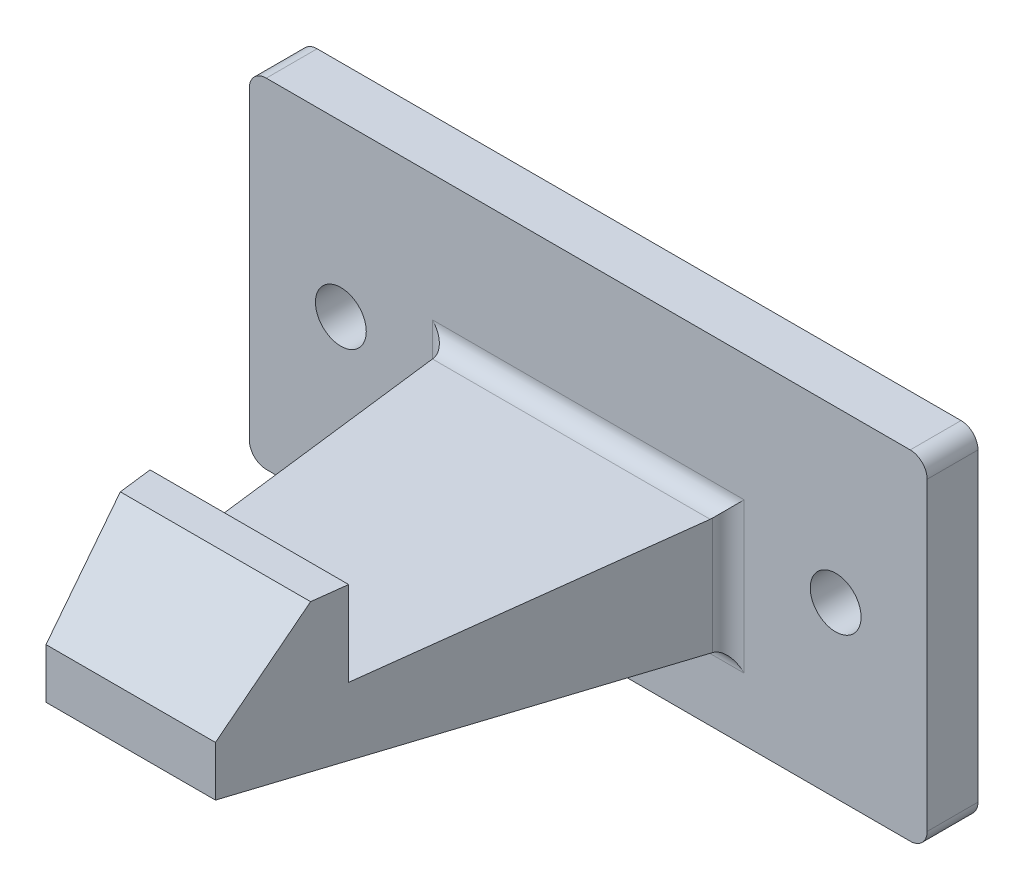
ISO-10303-21;
HEADER;
FILE_DESCRIPTION(('STEP AP214'),'2;1');
FILE_NAME('part.step','',(''),(''),'','','');
FILE_SCHEMA(('AUTOMOTIVE_DESIGN { 1 0 10303 214 1 1 1 1 }'));
ENDSEC;
DATA;
#1=APPLICATION_CONTEXT('core data for automotive mechanical design processes');
#2=APPLICATION_PROTOCOL_DEFINITION('international standard','automotive_design',2000,#1);
#3=PRODUCT_CONTEXT('',#1,'mechanical');
#4=PRODUCT('Part','Part','',(#3));
#5=PRODUCT_RELATED_PRODUCT_CATEGORY('part','',(#4));
#6=PRODUCT_DEFINITION_FORMATION('','',#4);
#7=PRODUCT_DEFINITION_CONTEXT('part definition',#1,'design');
#8=PRODUCT_DEFINITION('design','',#6,#7);
#9=PRODUCT_DEFINITION_SHAPE('','',#8);
#10=(LENGTH_UNIT() NAMED_UNIT(*) SI_UNIT(.MILLI.,.METRE.));
#11=(NAMED_UNIT(*) PLANE_ANGLE_UNIT() SI_UNIT($,.RADIAN.));
#12=(NAMED_UNIT(*) SI_UNIT($,.STERADIAN.) SOLID_ANGLE_UNIT());
#13=UNCERTAINTY_MEASURE_WITH_UNIT(LENGTH_MEASURE(1.E-05),#10,'distance_accuracy_value','');
#14=(GEOMETRIC_REPRESENTATION_CONTEXT(3) GLOBAL_UNCERTAINTY_ASSIGNED_CONTEXT((#13)) GLOBAL_UNIT_ASSIGNED_CONTEXT((#10,
#11,#12)) REPRESENTATION_CONTEXT('',''));
#15=CARTESIAN_POINT('',(0.,0.,0.));
#16=DIRECTION('',(0.,0.,1.));
#17=DIRECTION('',(1.,0.,0.));
#18=AXIS2_PLACEMENT_3D('',#15,#16,#17);
#19=CARTESIAN_POINT('',(20.,10.,3.));
#20=DIRECTION('',(-1.,0.,0.));
#21=DIRECTION('',(0.,0.,1.));
#22=AXIS2_PLACEMENT_3D('',#19,#20,#21);
#23=PLANE('',#22);
#24=DIRECTION('',(0.,1.,0.));
#25=VECTOR('',#24,1.);
#26=CARTESIAN_POINT('',(20.,10.,0.));
#27=LINE('',#26,#25);
#28=CARTESIAN_POINT('',(20.,-9.,0.));
#29=VERTEX_POINT('',#28);
#30=CARTESIAN_POINT('',(20.,9.,0.));
#31=VERTEX_POINT('',#30);
#32=EDGE_CURVE('E186',#29,#31,#27,.T.);
#33=ORIENTED_EDGE('',*,*,#32,.T.);
#34=DIRECTION('',(0.,0.,-1.));
#35=VECTOR('',#34,1.);
#36=CARTESIAN_POINT('',(20.,9.,3.));
#37=LINE('',#36,#35);
#38=CARTESIAN_POINT('',(20.,9.,3.));
#39=VERTEX_POINT('',#38);
#40=EDGE_CURVE('E292',#31,#39,#37,.F.);
#41=ORIENTED_EDGE('',*,*,#40,.T.);
#42=DIRECTION('',(0.,1.,0.));
#43=VECTOR('',#42,1.);
#44=CARTESIAN_POINT('',(20.,10.,3.));
#45=LINE('',#44,#43);
#46=CARTESIAN_POINT('',(20.,-9.,3.));
#47=VERTEX_POINT('',#46);
#48=EDGE_CURVE('E218',#47,#39,#45,.T.);
#49=ORIENTED_EDGE('',*,*,#48,.F.);
#50=DIRECTION('',(0.,0.,-1.));
#51=VECTOR('',#50,1.);
#52=CARTESIAN_POINT('',(20.,-9.,3.));
#53=LINE('',#52,#51);
#54=EDGE_CURVE('E289',#47,#29,#53,.T.);
#55=ORIENTED_EDGE('',*,*,#54,.T.);
#56=EDGE_LOOP('',(#33,#41,#49,#55));
#57=FACE_BOUND('',#56,.T.);
#58=ADVANCED_FACE('F35',(#57),#23,.F.);
#59=CARTESIAN_POINT('',(-20.,10.,3.));
#60=DIRECTION('',(0.,-1.,0.));
#61=DIRECTION('',(0.,0.,-1.));
#62=AXIS2_PLACEMENT_3D('',#59,#60,#61);
#63=PLANE('',#62);
#64=DIRECTION('',(-1.,0.,0.));
#65=VECTOR('',#64,1.);
#66=CARTESIAN_POINT('',(-20.,10.,3.));
#67=LINE('',#66,#65);
#68=CARTESIAN_POINT('',(19.,10.,3.));
#69=VERTEX_POINT('',#68);
#70=CARTESIAN_POINT('',(-19.,10.,3.));
#71=VERTEX_POINT('',#70);
#72=EDGE_CURVE('E221',#69,#71,#67,.T.);
#73=ORIENTED_EDGE('',*,*,#72,.F.);
#74=DIRECTION('',(0.,0.,-1.));
#75=VECTOR('',#74,1.);
#76=CARTESIAN_POINT('',(19.,10.,3.));
#77=LINE('',#76,#75);
#78=CARTESIAN_POINT('',(19.,10.,0.));
#79=VERTEX_POINT('',#78);
#80=EDGE_CURVE('E278',#69,#79,#77,.T.);
#81=ORIENTED_EDGE('',*,*,#80,.T.);
#82=DIRECTION('',(-1.,0.,0.));
#83=VECTOR('',#82,1.);
#84=CARTESIAN_POINT('',(-20.,10.,0.));
#85=LINE('',#84,#83);
#86=CARTESIAN_POINT('',(-19.,10.,0.));
#87=VERTEX_POINT('',#86);
#88=EDGE_CURVE('E232',#79,#87,#85,.T.);
#89=ORIENTED_EDGE('',*,*,#88,.T.);
#90=DIRECTION('',(0.,0.,-1.));
#91=VECTOR('',#90,1.);
#92=CARTESIAN_POINT('',(-19.,10.,3.));
#93=LINE('',#92,#91);
#94=EDGE_CURVE('E265',#87,#71,#93,.F.);
#95=ORIENTED_EDGE('',*,*,#94,.T.);
#96=EDGE_LOOP('',(#73,#81,#89,#95));
#97=FACE_BOUND('',#96,.T.);
#98=ADVANCED_FACE('F336',(#97),#63,.F.);
#99=CARTESIAN_POINT('',(-20.,10.,3.));
#100=DIRECTION('',(1.,0.,0.));
#101=DIRECTION('',(0.,0.,-1.));
#102=AXIS2_PLACEMENT_3D('',#99,#100,#101);
#103=PLANE('',#102);
#104=DIRECTION('',(0.,-1.,0.));
#105=VECTOR('',#104,1.);
#106=CARTESIAN_POINT('',(-20.,10.,0.));
#107=LINE('',#106,#105);
#108=CARTESIAN_POINT('',(-20.,9.,0.));
#109=VERTEX_POINT('',#108);
#110=CARTESIAN_POINT('',(-20.,-9.,0.));
#111=VERTEX_POINT('',#110);
#112=EDGE_CURVE('E235',#109,#111,#107,.T.);
#113=ORIENTED_EDGE('',*,*,#112,.T.);
#114=DIRECTION('',(0.,0.,-1.));
#115=VECTOR('',#114,1.);
#116=CARTESIAN_POINT('',(-20.,-9.,3.));
#117=LINE('',#116,#115);
#118=CARTESIAN_POINT('',(-20.,-9.,3.));
#119=VERTEX_POINT('',#118);
#120=EDGE_CURVE('E11',#111,#119,#117,.F.);
#121=ORIENTED_EDGE('',*,*,#120,.T.);
#122=DIRECTION('',(0.,-1.,0.));
#123=VECTOR('',#122,1.);
#124=CARTESIAN_POINT('',(-20.,10.,3.));
#125=LINE('',#124,#123);
#126=CARTESIAN_POINT('',(-20.,9.,3.));
#127=VERTEX_POINT('',#126);
#128=EDGE_CURVE('E225',#127,#119,#125,.T.);
#129=ORIENTED_EDGE('',*,*,#128,.F.);
#130=DIRECTION('',(0.,0.,-1.));
#131=VECTOR('',#130,1.);
#132=CARTESIAN_POINT('',(-20.,9.,3.));
#133=LINE('',#132,#131);
#134=EDGE_CURVE('E43',#127,#109,#133,.T.);
#135=ORIENTED_EDGE('',*,*,#134,.T.);
#136=EDGE_LOOP('',(#113,#121,#129,#135));
#137=FACE_BOUND('',#136,.T.);
#138=ADVANCED_FACE('F309',(#137),#103,.F.);
#139=CARTESIAN_POINT('',(-20.,-10.,3.));
#140=DIRECTION('',(0.,1.,0.));
#141=DIRECTION('',(0.,0.,1.));
#142=AXIS2_PLACEMENT_3D('',#139,#140,#141);
#143=PLANE('',#142);
#144=DIRECTION('',(1.,0.,0.));
#145=VECTOR('',#144,1.);
#146=CARTESIAN_POINT('',(-20.,-10.,0.));
#147=LINE('',#146,#145);
#148=CARTESIAN_POINT('',(-19.,-10.,0.));
#149=VERTEX_POINT('',#148);
#150=CARTESIAN_POINT('',(19.,-10.,0.));
#151=VERTEX_POINT('',#150);
#152=EDGE_CURVE('E222',#149,#151,#147,.T.);
#153=ORIENTED_EDGE('',*,*,#152,.T.);
#154=DIRECTION('',(0.,0.,-1.));
#155=VECTOR('',#154,1.);
#156=CARTESIAN_POINT('',(19.,-10.,3.));
#157=LINE('',#156,#155);
#158=CARTESIAN_POINT('',(19.,-10.,3.));
#159=VERTEX_POINT('',#158);
#160=EDGE_CURVE('E50',#151,#159,#157,.F.);
#161=ORIENTED_EDGE('',*,*,#160,.T.);
#162=DIRECTION('',(1.,0.,0.));
#163=VECTOR('',#162,1.);
#164=CARTESIAN_POINT('',(-20.,-10.,3.));
#165=LINE('',#164,#163);
#166=CARTESIAN_POINT('',(-19.,-10.,3.));
#167=VERTEX_POINT('',#166);
#168=EDGE_CURVE('E227',#167,#159,#165,.T.);
#169=ORIENTED_EDGE('',*,*,#168,.F.);
#170=DIRECTION('',(0.,0.,-1.));
#171=VECTOR('',#170,1.);
#172=CARTESIAN_POINT('',(-19.,-10.,3.));
#173=LINE('',#172,#171);
#174=EDGE_CURVE('E301',#167,#149,#173,.T.);
#175=ORIENTED_EDGE('',*,*,#174,.T.);
#176=EDGE_LOOP('',(#153,#161,#169,#175));
#177=FACE_BOUND('',#176,.T.);
#178=ADVANCED_FACE('F320',(#177),#143,.F.);
#179=CARTESIAN_POINT('',(0.,0.,3.));
#180=DIRECTION('',(0.,0.,1.));
#181=DIRECTION('',(1.,0.,0.));
#182=AXIS2_PLACEMENT_3D('',#179,#180,#181);
#183=PLANE('',#182);
#184=CARTESIAN_POINT('',(14.5999542044672,0.,3.));
#185=DIRECTION('',(0.,0.,-1.));
#186=DIRECTION('',(-1.,0.,0.));
#187=AXIS2_PLACEMENT_3D('',#184,#185,#186);
#188=CIRCLE('',#187,1.5);
#189=CARTESIAN_POINT('',(16.0999542044672,0.,3.));
#190=VERTEX_POINT('',#189);
#191=EDGE_CURVE('E561',#190,#190,#188,.T.);
#192=ORIENTED_EDGE('',*,*,#191,.T.);
#193=EDGE_LOOP('',(#192));
#194=FACE_BOUND('',#193,.T.);
#195=CARTESIAN_POINT('',(-14.5999542044672,0.,3.));
#196=DIRECTION('',(0.,0.,1.));
#197=DIRECTION('',(1.,0.,0.));
#198=AXIS2_PLACEMENT_3D('',#195,#196,#197);
#199=CIRCLE('',#198,1.5);
#200=CARTESIAN_POINT('',(-13.0999542044672,0.,3.));
#201=VERTEX_POINT('',#200);
#202=EDGE_CURVE('E565',#201,#201,#199,.T.);
#203=ORIENTED_EDGE('',*,*,#202,.F.);
#204=EDGE_LOOP('',(#203));
#205=FACE_BOUND('',#204,.T.);
#206=DIRECTION('',(0.,1.,0.));
#207=VECTOR('',#206,1.);
#208=CARTESIAN_POINT('',(-9.19990840893437,1.55,3.));
#209=LINE('',#208,#207);
#210=CARTESIAN_POINT('',(-9.19990840893437,-6.31118742080778,3.));
#211=VERTEX_POINT('',#210);
#212=CARTESIAN_POINT('',(-9.19990840893437,2.55,3.));
#213=VERTEX_POINT('',#212);
#214=EDGE_CURVE('E240',#211,#213,#209,.T.);
#215=ORIENTED_EDGE('',*,*,#214,.T.);
#216=DIRECTION('',(1.,0.,0.));
#217=VECTOR('',#216,1.);
#218=CARTESIAN_POINT('',(8.31518314437843,2.55,3.));
#219=LINE('',#218,#217);
#220=CARTESIAN_POINT('',(9.19990840893437,2.55,3.));
#221=VERTEX_POINT('',#220);
#222=EDGE_CURVE('E244',#213,#221,#219,.T.);
#223=ORIENTED_EDGE('',*,*,#222,.T.);
#224=DIRECTION('',(0.,-1.,0.));
#225=VECTOR('',#224,1.);
#226=CARTESIAN_POINT('',(9.19990840893437,-5.44999999999995,3.));
#227=LINE('',#226,#225);
#228=CARTESIAN_POINT('',(9.19990840893437,-6.31118742080778,3.));
#229=VERTEX_POINT('',#228);
#230=EDGE_CURVE('E242',#221,#229,#227,.T.);
#231=ORIENTED_EDGE('',*,*,#230,.T.);
#232=DIRECTION('',(-1.,0.,0.));
#233=VECTOR('',#232,1.);
#234=CARTESIAN_POINT('',(-8.31518314437843,-6.31118742080778,3.));
#235=LINE('',#234,#233);
#236=EDGE_CURVE('E229',#229,#211,#235,.T.);
#237=ORIENTED_EDGE('',*,*,#236,.T.);
#238=EDGE_LOOP('',(#215,#223,#231,#237));
#239=FACE_BOUND('',#238,.T.);
#240=ORIENTED_EDGE('',*,*,#48,.T.);
#241=CARTESIAN_POINT('',(19.,9.,3.));
#242=DIRECTION('',(0.,0.,1.));
#243=DIRECTION('',(1.,0.,0.));
#244=AXIS2_PLACEMENT_3D('',#241,#242,#243);
#245=CIRCLE('',#244,1.);
#246=EDGE_CURVE('E299',#39,#69,#245,.T.);
#247=ORIENTED_EDGE('',*,*,#246,.T.);
#248=ORIENTED_EDGE('',*,*,#72,.T.);
#249=CARTESIAN_POINT('',(-19.,9.,3.));
#250=DIRECTION('',(0.,0.,1.));
#251=DIRECTION('',(1.,0.,0.));
#252=AXIS2_PLACEMENT_3D('',#249,#250,#251);
#253=CIRCLE('',#252,1.);
#254=EDGE_CURVE('E294',#71,#127,#253,.T.);
#255=ORIENTED_EDGE('',*,*,#254,.T.);
#256=ORIENTED_EDGE('',*,*,#128,.T.);
#257=CARTESIAN_POINT('',(-19.,-9.,3.));
#258=DIRECTION('',(0.,0.,1.));
#259=DIRECTION('',(1.,0.,0.));
#260=AXIS2_PLACEMENT_3D('',#257,#258,#259);
#261=CIRCLE('',#260,1.);
#262=EDGE_CURVE('E57',#119,#167,#261,.T.);
#263=ORIENTED_EDGE('',*,*,#262,.T.);
#264=ORIENTED_EDGE('',*,*,#168,.T.);
#265=CARTESIAN_POINT('',(19.,-9.,3.));
#266=DIRECTION('',(0.,0.,1.));
#267=DIRECTION('',(1.,0.,0.));
#268=AXIS2_PLACEMENT_3D('',#265,#266,#267);
#269=CIRCLE('',#268,1.);
#270=EDGE_CURVE('E297',#159,#47,#269,.T.);
#271=ORIENTED_EDGE('',*,*,#270,.T.);
#272=EDGE_LOOP('',(#240,#247,#248,#255,#256,#263,#264,#271));
#273=FACE_BOUND('',#272,.T.);
#274=ADVANCED_FACE('F322',(#194,#205,#239,#273),#183,.T.);
#275=CARTESIAN_POINT('',(0.,0.,0.));
#276=DIRECTION('',(0.,0.,1.));
#277=DIRECTION('',(1.,0.,0.));
#278=AXIS2_PLACEMENT_3D('',#275,#276,#277);
#279=PLANE('',#278);
#280=CARTESIAN_POINT('',(14.5999542044672,0.,0.));
#281=DIRECTION('',(0.,0.,1.));
#282=DIRECTION('',(1.,0.,0.));
#283=AXIS2_PLACEMENT_3D('',#280,#281,#282);
#284=CIRCLE('',#283,1.5);
#285=CARTESIAN_POINT('',(16.0999542044672,0.,0.));
#286=VERTEX_POINT('',#285);
#287=EDGE_CURVE('E597',#286,#286,#284,.T.);
#288=ORIENTED_EDGE('',*,*,#287,.T.);
#289=EDGE_LOOP('',(#288));
#290=FACE_BOUND('',#289,.T.);
#291=CARTESIAN_POINT('',(-14.5999542044672,0.,0.));
#292=DIRECTION('',(0.,0.,1.));
#293=DIRECTION('',(1.,0.,0.));
#294=AXIS2_PLACEMENT_3D('',#291,#292,#293);
#295=CIRCLE('',#294,1.5);
#296=CARTESIAN_POINT('',(-13.0999542044672,0.,0.));
#297=VERTEX_POINT('',#296);
#298=EDGE_CURVE('E269',#297,#297,#295,.F.);
#299=ORIENTED_EDGE('',*,*,#298,.F.);
#300=EDGE_LOOP('',(#299));
#301=FACE_BOUND('',#300,.T.);
#302=ORIENTED_EDGE('',*,*,#88,.F.);
#303=CARTESIAN_POINT('',(19.,9.,0.));
#304=DIRECTION('',(0.,0.,1.));
#305=DIRECTION('',(1.,0.,0.));
#306=AXIS2_PLACEMENT_3D('',#303,#304,#305);
#307=CIRCLE('',#306,1.);
#308=EDGE_CURVE('E287',#79,#31,#307,.F.);
#309=ORIENTED_EDGE('',*,*,#308,.T.);
#310=ORIENTED_EDGE('',*,*,#32,.F.);
#311=CARTESIAN_POINT('',(19.,-9.,0.));
#312=DIRECTION('',(0.,0.,1.));
#313=DIRECTION('',(1.,0.,0.));
#314=AXIS2_PLACEMENT_3D('',#311,#312,#313);
#315=CIRCLE('',#314,1.);
#316=EDGE_CURVE('E285',#29,#151,#315,.F.);
#317=ORIENTED_EDGE('',*,*,#316,.T.);
#318=ORIENTED_EDGE('',*,*,#152,.F.);
#319=CARTESIAN_POINT('',(-19.,-9.,0.));
#320=DIRECTION('',(0.,0.,1.));
#321=DIRECTION('',(1.,0.,0.));
#322=AXIS2_PLACEMENT_3D('',#319,#320,#321);
#323=CIRCLE('',#322,1.);
#324=EDGE_CURVE('E283',#149,#111,#323,.F.);
#325=ORIENTED_EDGE('',*,*,#324,.T.);
#326=ORIENTED_EDGE('',*,*,#112,.F.);
#327=CARTESIAN_POINT('',(-19.,9.,0.));
#328=DIRECTION('',(0.,0.,1.));
#329=DIRECTION('',(1.,0.,0.));
#330=AXIS2_PLACEMENT_3D('',#327,#328,#329);
#331=CIRCLE('',#330,1.);
#332=EDGE_CURVE('E281',#109,#87,#331,.F.);
#333=ORIENTED_EDGE('',*,*,#332,.T.);
#334=EDGE_LOOP('',(#302,#309,#310,#317,#318,#325,#326,#333));
#335=FACE_BOUND('',#334,.T.);
#336=ADVANCED_FACE('F315',(#290,#301,#335),#279,.F.);
#337=CARTESIAN_POINT('',(0.,1.55,-483.5));
#338=DIRECTION('',(0.,1.,0.));
#339=DIRECTION('',(1.,0.,0.));
#340=AXIS2_PLACEMENT_3D('',#337,#338,#339);
#341=PLANE('',#340);
#342=DIRECTION('',(0.121869343405148,0.,-0.992546151641322));
#343=VECTOR('',#342,1.);
#344=CARTESIAN_POINT('',(5.,1.55,30.));
#345=LINE('',#344,#343);
#346=CARTESIAN_POINT('',(5.85949192632033,1.55,23.));
#347=VERTEX_POINT('',#346);
#348=CARTESIAN_POINT('',(8.19239858347552,1.55,4.));
#349=VERTEX_POINT('',#348);
#350=EDGE_CURVE('E200',#347,#349,#345,.T.);
#351=ORIENTED_EDGE('',*,*,#350,.T.);
#352=DIRECTION('',(1.,0.,0.));
#353=VECTOR('',#352,1.);
#354=CARTESIAN_POINT('',(-8.31518314437843,1.55,4.));
#355=LINE('',#354,#353);
#356=CARTESIAN_POINT('',(-8.19239858347552,1.55,4.));
#357=VERTEX_POINT('',#356);
#358=EDGE_CURVE('E247',#349,#357,#355,.F.);
#359=ORIENTED_EDGE('',*,*,#358,.T.);
#360=DIRECTION('',(0.121869343405148,0.,0.992546151641322));
#361=VECTOR('',#360,1.);
#362=CARTESIAN_POINT('',(-5.,1.55,30.));
#363=LINE('',#362,#361);
#364=CARTESIAN_POINT('',(-5.85949192632033,1.55,23.));
#365=VERTEX_POINT('',#364);
#366=EDGE_CURVE('E208',#357,#365,#363,.T.);
#367=ORIENTED_EDGE('',*,*,#366,.T.);
#368=DIRECTION('',(1.,0.,0.));
#369=VECTOR('',#368,1.);
#370=CARTESIAN_POINT('',(0.,1.55,23.));
#371=LINE('',#370,#369);
#372=EDGE_CURVE('E183',#365,#347,#371,.T.);
#373=ORIENTED_EDGE('',*,*,#372,.T.);
#374=EDGE_LOOP('',(#351,#359,#367,#373));
#375=FACE_BOUND('',#374,.T.);
#376=ADVANCED_FACE('F490',(#375),#341,.T.);
#377=CARTESIAN_POINT('',(-5.,-1.4,30.));
#378=DIRECTION('',(-0.992546151641322,0.,0.121869343405148));
#379=DIRECTION('',(-0.121869343405148,0.,-0.992546151641322));
#380=AXIS2_PLACEMENT_3D('',#377,#378,#379);
#381=PLANE('',#380);
#382=CARTESIAN_POINT('',(-8.19239858347552,2.55,4.));
#383=DIRECTION('',(-0.992546151641322,0.,0.121869343405148));
#384=DIRECTION('',(-0.121869343405148,0.,-0.992546151641322));
#385=AXIS2_PLACEMENT_3D('',#382,#383,#384);
#386=ELLIPSE('',#385,1.00750982545885,1.);
#387=CARTESIAN_POINT('',(-8.20736225729305,1.55745384835868,3.87813065659485));
#388=VERTEX_POINT('',#387);
#389=EDGE_CURVE('E258',#357,#388,#386,.F.);
#390=ORIENTED_EDGE('',*,*,#389,.T.);
#391=DIRECTION('',(0.,1.,0.));
#392=VECTOR('',#391,1.);
#393=CARTESIAN_POINT('',(-8.20736225729305,-5.44999999999995,3.87813065659485));
#394=LINE('',#393,#392);
#395=CARTESIAN_POINT('',(-8.20736225729305,-5.31828040151072,3.87813065659486));
#396=VERTEX_POINT('',#395);
#397=EDGE_CURVE('E252',#388,#396,#394,.F.);
#398=ORIENTED_EDGE('',*,*,#397,.T.);
#399=DIRECTION('',(-0.120540723140913,-0.147258811190723,-0.981725407938167));
#400=VECTOR('',#399,1.);
#401=CARTESIAN_POINT('',(-5.,-1.4,30.));
#402=LINE('',#401,#400);
#403=CARTESIAN_POINT('',(-5.,-1.4,30.));
#404=VERTEX_POINT('',#403);
#405=EDGE_CURVE('E215',#404,#396,#402,.T.);
#406=ORIENTED_EDGE('',*,*,#405,.F.);
#407=DIRECTION('',(0.,1.,0.));
#408=VECTOR('',#407,1.);
#409=CARTESIAN_POINT('',(-5.,-1.4,30.));
#410=LINE('',#409,#408);
#411=CARTESIAN_POINT('',(-5.,1.55,30.));
#412=VERTEX_POINT('',#411);
#413=EDGE_CURVE('E195',#404,#412,#410,.T.);
#414=ORIENTED_EDGE('',*,*,#413,.T.);
#415=DIRECTION('',(0.0864964017104582,-0.704456660303223,0.704456660303224));
#416=VECTOR('',#415,1.);
#417=CARTESIAN_POINT('',(-4.82024774948227,0.0860354005755817,31.4639645994244));
#418=LINE('',#417,#416);
#419=CARTESIAN_POINT('',(-5.61392280451452,6.55,25.));
#420=VERTEX_POINT('',#419);
#421=EDGE_CURVE('E193',#420,#412,#418,.T.);
#422=ORIENTED_EDGE('',*,*,#421,.F.);
#423=DIRECTION('',(-0.121869343405148,0.,-0.992546151641322));
#424=VECTOR('',#423,1.);
#425=CARTESIAN_POINT('',(-5.,6.55,30.));
#426=LINE('',#425,#424);
#427=CARTESIAN_POINT('',(-5.85949192632034,6.55,23.));
#428=VERTEX_POINT('',#427);
#429=EDGE_CURVE('E171',#420,#428,#426,.T.);
#430=ORIENTED_EDGE('',*,*,#429,.T.);
#431=DIRECTION('',(0.,1.,0.));
#432=VECTOR('',#431,1.);
#433=CARTESIAN_POINT('',(-5.85949192632034,-1.4,23.));
#434=LINE('',#433,#432);
#435=EDGE_CURVE('E176',#365,#428,#434,.T.);
#436=ORIENTED_EDGE('',*,*,#435,.F.);
#437=ORIENTED_EDGE('',*,*,#366,.F.);
#438=EDGE_LOOP('',(#390,#398,#406,#414,#422,#430,#436,#437));
#439=FACE_BOUND('',#438,.T.);
#440=ADVANCED_FACE('F190',(#439),#381,.T.);
#441=CARTESIAN_POINT('',(0.,-1.4,30.));
#442=DIRECTION('',(0.,0.,1.));
#443=DIRECTION('',(0.,1.,0.));
#444=AXIS2_PLACEMENT_3D('',#441,#442,#443);
#445=PLANE('',#444);
#446=ORIENTED_EDGE('',*,*,#413,.F.);
#447=DIRECTION('',(-1.,0.,0.));
#448=VECTOR('',#447,1.);
#449=CARTESIAN_POINT('',(0.,-1.4,30.));
#450=LINE('',#449,#448);
#451=CARTESIAN_POINT('',(5.,-1.4,30.));
#452=VERTEX_POINT('',#451);
#453=EDGE_CURVE('E214',#452,#404,#450,.T.);
#454=ORIENTED_EDGE('',*,*,#453,.F.);
#455=DIRECTION('',(0.,1.,0.));
#456=VECTOR('',#455,1.);
#457=CARTESIAN_POINT('',(5.,-1.4,30.));
#458=LINE('',#457,#456);
#459=CARTESIAN_POINT('',(5.,1.55,30.));
#460=VERTEX_POINT('',#459);
#461=EDGE_CURVE('E194',#452,#460,#458,.T.);
#462=ORIENTED_EDGE('',*,*,#461,.T.);
#463=DIRECTION('',(1.,0.,0.));
#464=VECTOR('',#463,1.);
#465=CARTESIAN_POINT('',(0.,1.55,30.));
#466=LINE('',#465,#464);
#467=EDGE_CURVE('E589',#412,#460,#466,.T.);
#468=ORIENTED_EDGE('',*,*,#467,.F.);
#469=EDGE_LOOP('',(#446,#454,#462,#468));
#470=FACE_BOUND('',#469,.T.);
#471=ADVANCED_FACE('F474',(#470),#445,.T.);
#472=CARTESIAN_POINT('',(0.,-1.4,30.));
#473=DIRECTION('',(0.,-0.988936352868298,0.148340452930243));
#474=DIRECTION('',(0.,0.148340452930243,0.988936352868298));
#475=AXIS2_PLACEMENT_3D('',#472,#473,#474);
#476=PLANE('',#475);
#477=CARTESIAN_POINT('',(-9.19990840893437,-5.29999999999995,4.));
#478=DIRECTION('',(0.,-0.988936352868298,0.148340452930243));
#479=DIRECTION('',(0.,-0.148340452930243,-0.988936352868298));
#480=AXIS2_PLACEMENT_3D('',#477,#478,#479);
#481=ELLIPSE('',#480,1.01118742080783,1.);
#482=CARTESIAN_POINT('',(-8.21097205606607,-5.32225106793949,3.85165954706976));
#483=VERTEX_POINT('',#482);
#484=EDGE_CURVE('E262',#396,#483,#481,.F.);
#485=ORIENTED_EDGE('',*,*,#484,.T.);
#486=DIRECTION('',(-1.,0.,0.));
#487=VECTOR('',#486,1.);
#488=CARTESIAN_POINT('',(8.31518314437843,-5.32225106793949,3.85165954706976));
#489=LINE('',#488,#487);
#490=CARTESIAN_POINT('',(8.21097205606607,-5.32225106793949,3.85165954706976));
#491=VERTEX_POINT('',#490);
#492=EDGE_CURVE('E254',#483,#491,#489,.F.);
#493=ORIENTED_EDGE('',*,*,#492,.T.);
#494=CARTESIAN_POINT('',(9.19990840893437,-5.29999999999995,4.));
#495=DIRECTION('',(0.,-0.988936352868298,0.148340452930243));
#496=DIRECTION('',(0.,0.148340452930243,0.988936352868298));
#497=AXIS2_PLACEMENT_3D('',#494,#495,#496);
#498=ELLIPSE('',#497,1.01118742080783,1.);
#499=CARTESIAN_POINT('',(8.20736225729305,-5.31828040151072,3.87813065659486));
#500=VERTEX_POINT('',#499);
#501=EDGE_CURVE('E260',#491,#500,#498,.F.);
#502=ORIENTED_EDGE('',*,*,#501,.T.);
#503=DIRECTION('',(-0.120540723140913,0.147258811190723,0.981725407938167));
#504=VECTOR('',#503,1.);
#505=CARTESIAN_POINT('',(5.,-1.4,30.));
#506=LINE('',#505,#504);
#507=EDGE_CURVE('E198',#500,#452,#506,.T.);
#508=ORIENTED_EDGE('',*,*,#507,.T.);
#509=ORIENTED_EDGE('',*,*,#453,.T.);
#510=ORIENTED_EDGE('',*,*,#405,.T.);
#511=EDGE_LOOP('',(#485,#493,#502,#508,#509,#510));
#512=FACE_BOUND('',#511,.T.);
#513=ADVANCED_FACE('F462',(#512),#476,.T.);
#514=CARTESIAN_POINT('',(5.,-1.4,30.));
#515=DIRECTION('',(0.992546151641322,0.,0.121869343405148));
#516=DIRECTION('',(-0.121869343405148,0.,0.992546151641322));
#517=AXIS2_PLACEMENT_3D('',#514,#515,#516);
#518=PLANE('',#517);
#519=ORIENTED_EDGE('',*,*,#507,.F.);
#520=DIRECTION('',(0.,-1.,0.));
#521=VECTOR('',#520,1.);
#522=CARTESIAN_POINT('',(8.20736225729305,1.55,3.87813065659485));
#523=LINE('',#522,#521);
#524=CARTESIAN_POINT('',(8.20736225729305,1.55745384835868,3.87813065659485));
#525=VERTEX_POINT('',#524);
#526=EDGE_CURVE('E250',#500,#525,#523,.F.);
#527=ORIENTED_EDGE('',*,*,#526,.T.);
#528=CARTESIAN_POINT('',(8.19239858347552,2.55,4.));
#529=DIRECTION('',(0.992546151641322,0.,0.121869343405148));
#530=DIRECTION('',(-0.121869343405148,0.,0.992546151641322));
#531=AXIS2_PLACEMENT_3D('',#528,#529,#530);
#532=ELLIPSE('',#531,1.00750982545885,1.);
#533=EDGE_CURVE('E256',#525,#349,#532,.F.);
#534=ORIENTED_EDGE('',*,*,#533,.T.);
#535=ORIENTED_EDGE('',*,*,#350,.F.);
#536=DIRECTION('',(0.,1.,0.));
#537=VECTOR('',#536,1.);
#538=CARTESIAN_POINT('',(5.85949192632033,1.55,23.));
#539=LINE('',#538,#537);
#540=CARTESIAN_POINT('',(5.85949192632034,6.55,23.));
#541=VERTEX_POINT('',#540);
#542=EDGE_CURVE('E207',#347,#541,#539,.T.);
#543=ORIENTED_EDGE('',*,*,#542,.T.);
#544=DIRECTION('',(-0.121869343405148,0.,0.992546151641322));
#545=VECTOR('',#544,1.);
#546=CARTESIAN_POINT('',(5.,6.55,30.));
#547=LINE('',#546,#545);
#548=CARTESIAN_POINT('',(5.61392280451452,6.55,25.));
#549=VERTEX_POINT('',#548);
#550=EDGE_CURVE('E173',#541,#549,#547,.T.);
#551=ORIENTED_EDGE('',*,*,#550,.T.);
#552=DIRECTION('',(0.0864964017104582,0.704456660303223,-0.704456660303224));
#553=VECTOR('',#552,1.);
#554=CARTESIAN_POINT('',(4.82024774948227,0.0860354005755817,31.4639645994244));
#555=LINE('',#554,#553);
#556=EDGE_CURVE('E177',#460,#549,#555,.T.);
#557=ORIENTED_EDGE('',*,*,#556,.F.);
#558=ORIENTED_EDGE('',*,*,#461,.F.);
#559=EDGE_LOOP('',(#519,#527,#534,#535,#543,#551,#557,#558));
#560=FACE_BOUND('',#559,.T.);
#561=ADVANCED_FACE('F453',(#560),#518,.T.);
#562=CARTESIAN_POINT('',(0.,1.55,30.));
#563=DIRECTION('',(0.,0.707106781186548,0.707106781186547));
#564=DIRECTION('',(0.,0.707106781186547,-0.707106781186548));
#565=AXIS2_PLACEMENT_3D('',#562,#563,#564);
#566=PLANE('',#565);
#567=DIRECTION('',(-1.,0.,0.));
#568=VECTOR('',#567,1.);
#569=CARTESIAN_POINT('',(0.,6.55,25.));
#570=LINE('',#569,#568);
#571=EDGE_CURVE('E204',#549,#420,#570,.T.);
#572=ORIENTED_EDGE('',*,*,#571,.T.);
#573=ORIENTED_EDGE('',*,*,#421,.T.);
#574=ORIENTED_EDGE('',*,*,#467,.T.);
#575=ORIENTED_EDGE('',*,*,#556,.T.);
#576=EDGE_LOOP('',(#572,#573,#574,#575));
#577=FACE_BOUND('',#576,.T.);
#578=ADVANCED_FACE('F445',(#577),#566,.T.);
#579=CARTESIAN_POINT('',(0.,1.55,23.));
#580=DIRECTION('',(0.,0.,-1.));
#581=DIRECTION('',(0.,-1.,0.));
#582=AXIS2_PLACEMENT_3D('',#579,#580,#581);
#583=PLANE('',#582);
#584=DIRECTION('',(1.,0.,0.));
#585=VECTOR('',#584,1.);
#586=CARTESIAN_POINT('',(0.,6.55,23.));
#587=LINE('',#586,#585);
#588=EDGE_CURVE('E167',#428,#541,#587,.T.);
#589=ORIENTED_EDGE('',*,*,#588,.T.);
#590=ORIENTED_EDGE('',*,*,#542,.F.);
#591=ORIENTED_EDGE('',*,*,#372,.F.);
#592=ORIENTED_EDGE('',*,*,#435,.T.);
#593=EDGE_LOOP('',(#589,#590,#591,#592));
#594=FACE_BOUND('',#593,.T.);
#595=ADVANCED_FACE('F181',(#594),#583,.T.);
#596=CARTESIAN_POINT('',(0.,6.55,23.));
#597=DIRECTION('',(0.,-1.,0.));
#598=DIRECTION('',(-1.,0.,0.));
#599=AXIS2_PLACEMENT_3D('',#596,#597,#598);
#600=PLANE('',#599);
#601=ORIENTED_EDGE('',*,*,#571,.F.);
#602=ORIENTED_EDGE('',*,*,#550,.F.);
#603=ORIENTED_EDGE('',*,*,#588,.F.);
#604=ORIENTED_EDGE('',*,*,#429,.F.);
#605=EDGE_LOOP('',(#601,#602,#603,#604));
#606=FACE_BOUND('',#605,.T.);
#607=ADVANCED_FACE('F169',(#606),#600,.F.);
#608=CARTESIAN_POINT('',(0.,-6.31118742080778,4.));
#609=DIRECTION('',(1.,0.,0.));
#610=DIRECTION('',(0.,0.,-1.));
#611=AXIS2_PLACEMENT_3D('',#608,#609,#610);
#612=CYLINDRICAL_SURFACE('',#611,1.);
#613=ORIENTED_EDGE('',*,*,#492,.F.);
#614=CARTESIAN_POINT('',(-9.19990840893437,-6.31118742080778,4.));
#615=DIRECTION('',(0.707106781186547,-0.707106781186547,0.));
#616=DIRECTION('',(0.707106781186547,0.707106781186547,0.));
#617=AXIS2_PLACEMENT_3D('',#614,#615,#616);
#618=ELLIPSE('',#617,1.41421356237309,1.);
#619=EDGE_CURVE('E210',#211,#483,#618,.T.);
#620=ORIENTED_EDGE('',*,*,#619,.F.);
#621=ORIENTED_EDGE('',*,*,#236,.F.);
#622=CARTESIAN_POINT('',(9.19990840893437,-6.31118742080778,4.));
#623=DIRECTION('',(0.707106781186547,0.707106781186547,0.));
#624=DIRECTION('',(0.707106781186547,-0.707106781186547,0.));
#625=AXIS2_PLACEMENT_3D('',#622,#623,#624);
#626=ELLIPSE('',#625,1.41421356237309,1.);
#627=EDGE_CURVE('E272',#491,#229,#626,.F.);
#628=ORIENTED_EDGE('',*,*,#627,.F.);
#629=EDGE_LOOP('',(#613,#620,#621,#628));
#630=FACE_BOUND('',#629,.T.);
#631=ADVANCED_FACE('F362',(#630),#612,.F.);
#632=CARTESIAN_POINT('',(-9.19990840893437,0.,4.));
#633=DIRECTION('',(0.,-1.,0.));
#634=DIRECTION('',(0.,0.,-1.));
#635=AXIS2_PLACEMENT_3D('',#632,#633,#634);
#636=CYLINDRICAL_SURFACE('',#635,1.);
#637=ORIENTED_EDGE('',*,*,#397,.F.);
#638=CARTESIAN_POINT('',(-9.19990840893437,2.55,4.));
#639=DIRECTION('',(-0.707106781186547,-0.707106781186547,0.));
#640=DIRECTION('',(0.707106781186547,-0.707106781186547,0.));
#641=AXIS2_PLACEMENT_3D('',#638,#639,#640);
#642=ELLIPSE('',#641,1.41421356237309,1.);
#643=EDGE_CURVE('E268',#213,#388,#642,.T.);
#644=ORIENTED_EDGE('',*,*,#643,.F.);
#645=ORIENTED_EDGE('',*,*,#214,.F.);
#646=ORIENTED_EDGE('',*,*,#619,.T.);
#647=ORIENTED_EDGE('',*,*,#484,.F.);
#648=EDGE_LOOP('',(#637,#644,#645,#646,#647));
#649=FACE_BOUND('',#648,.T.);
#650=ADVANCED_FACE('F358',(#649),#636,.F.);
#651=CARTESIAN_POINT('',(9.19990840893437,0.,4.));
#652=DIRECTION('',(0.,1.,0.));
#653=DIRECTION('',(0.,0.,1.));
#654=AXIS2_PLACEMENT_3D('',#651,#652,#653);
#655=CYLINDRICAL_SURFACE('',#654,1.);
#656=ORIENTED_EDGE('',*,*,#627,.T.);
#657=ORIENTED_EDGE('',*,*,#230,.F.);
#658=CARTESIAN_POINT('',(9.19990840893437,2.55,4.));
#659=DIRECTION('',(-0.707106781186547,0.707106781186547,0.));
#660=DIRECTION('',(0.707106781186547,0.707106781186547,0.));
#661=AXIS2_PLACEMENT_3D('',#658,#659,#660);
#662=ELLIPSE('',#661,1.41421356237309,1.);
#663=EDGE_CURVE('E266',#525,#221,#662,.F.);
#664=ORIENTED_EDGE('',*,*,#663,.F.);
#665=ORIENTED_EDGE('',*,*,#526,.F.);
#666=ORIENTED_EDGE('',*,*,#501,.F.);
#667=EDGE_LOOP('',(#656,#657,#664,#665,#666));
#668=FACE_BOUND('',#667,.T.);
#669=ADVANCED_FACE('F354',(#668),#655,.F.);
#670=CARTESIAN_POINT('',(0.,2.55,4.));
#671=DIRECTION('',(-1.,0.,0.));
#672=DIRECTION('',(0.,0.,1.));
#673=AXIS2_PLACEMENT_3D('',#670,#671,#672);
#674=CYLINDRICAL_SURFACE('',#673,1.);
#675=ORIENTED_EDGE('',*,*,#389,.F.);
#676=ORIENTED_EDGE('',*,*,#358,.F.);
#677=ORIENTED_EDGE('',*,*,#533,.F.);
#678=ORIENTED_EDGE('',*,*,#663,.T.);
#679=ORIENTED_EDGE('',*,*,#222,.F.);
#680=ORIENTED_EDGE('',*,*,#643,.T.);
#681=EDGE_LOOP('',(#675,#676,#677,#678,#679,#680));
#682=FACE_BOUND('',#681,.T.);
#683=ADVANCED_FACE('F350',(#682),#674,.F.);
#684=CARTESIAN_POINT('',(-14.5999542044672,0.,-0.00100000000000013));
#685=DIRECTION('',(0.,0.,1.));
#686=DIRECTION('',(1.,0.,0.));
#687=AXIS2_PLACEMENT_3D('',#684,#685,#686);
#688=CYLINDRICAL_SURFACE('',#687,1.5);
#689=CARTESIAN_POINT('',(-13.0999542044672,0.,3.));
#690=CARTESIAN_POINT('',(-13.0999542044672,0.,2.96875));
#691=CARTESIAN_POINT('',(-13.0999542044672,0.,2.9375));
#692=CARTESIAN_POINT('',(-13.0999542044672,0.,2.875));
#693=CARTESIAN_POINT('',(-13.0999542044672,0.,2.84375));
#694=CARTESIAN_POINT('',(-13.0999542044672,0.,2.78125));
#695=CARTESIAN_POINT('',(-13.0999542044672,0.,2.75));
#696=CARTESIAN_POINT('',(-13.0999542044672,0.,2.6875));
#697=CARTESIAN_POINT('',(-13.0999542044672,0.,2.65625));
#698=CARTESIAN_POINT('',(-13.0999542044672,0.,2.59375));
#699=CARTESIAN_POINT('',(-13.0999542044672,0.,2.5625));
#700=CARTESIAN_POINT('',(-13.0999542044672,0.,2.5));
#701=CARTESIAN_POINT('',(-13.0999542044672,0.,2.46875));
#702=CARTESIAN_POINT('',(-13.0999542044672,0.,2.40625));
#703=CARTESIAN_POINT('',(-13.0999542044672,0.,2.375));
#704=CARTESIAN_POINT('',(-13.0999542044672,0.,2.3125));
#705=CARTESIAN_POINT('',(-13.0999542044672,0.,2.28125));
#706=CARTESIAN_POINT('',(-13.0999542044672,0.,2.21875));
#707=CARTESIAN_POINT('',(-13.0999542044672,0.,2.1875));
#708=CARTESIAN_POINT('',(-13.0999542044672,0.,2.125));
#709=CARTESIAN_POINT('',(-13.0999542044672,0.,2.09375));
#710=CARTESIAN_POINT('',(-13.0999542044672,0.,2.03125));
#711=CARTESIAN_POINT('',(-13.0999542044672,0.,2.));
#712=CARTESIAN_POINT('',(-13.0999542044672,0.,1.9375));
#713=CARTESIAN_POINT('',(-13.0999542044672,0.,1.90625));
#714=CARTESIAN_POINT('',(-13.0999542044672,0.,1.84375));
#715=CARTESIAN_POINT('',(-13.0999542044672,0.,1.8125));
#716=CARTESIAN_POINT('',(-13.0999542044672,0.,1.75));
#717=CARTESIAN_POINT('',(-13.0999542044672,0.,1.71875));
#718=CARTESIAN_POINT('',(-13.0999542044672,0.,1.65625));
#719=CARTESIAN_POINT('',(-13.0999542044672,0.,1.625));
#720=CARTESIAN_POINT('',(-13.0999542044672,0.,1.5625));
#721=CARTESIAN_POINT('',(-13.0999542044672,0.,1.53125));
#722=CARTESIAN_POINT('',(-13.0999542044672,0.,1.46875));
#723=CARTESIAN_POINT('',(-13.0999542044672,0.,1.4375));
#724=CARTESIAN_POINT('',(-13.0999542044672,0.,1.375));
#725=CARTESIAN_POINT('',(-13.0999542044672,0.,1.34375));
#726=CARTESIAN_POINT('',(-13.0999542044672,0.,1.28125));
#727=CARTESIAN_POINT('',(-13.0999542044672,0.,1.25));
#728=CARTESIAN_POINT('',(-13.0999542044672,0.,1.1875));
#729=CARTESIAN_POINT('',(-13.0999542044672,0.,1.15625));
#730=CARTESIAN_POINT('',(-13.0999542044672,0.,1.09375));
#731=CARTESIAN_POINT('',(-13.0999542044672,0.,1.0625));
#732=CARTESIAN_POINT('',(-13.0999542044672,0.,1.));
#733=CARTESIAN_POINT('',(-13.0999542044672,0.,0.96875));
#734=CARTESIAN_POINT('',(-13.0999542044672,0.,0.90625));
#735=CARTESIAN_POINT('',(-13.0999542044672,0.,0.875));
#736=CARTESIAN_POINT('',(-13.0999542044672,0.,0.8125));
#737=CARTESIAN_POINT('',(-13.0999542044672,0.,0.78125));
#738=CARTESIAN_POINT('',(-13.0999542044672,0.,0.71875));
#739=CARTESIAN_POINT('',(-13.0999542044672,0.,0.6875));
#740=CARTESIAN_POINT('',(-13.0999542044672,0.,0.625));
#741=CARTESIAN_POINT('',(-13.0999542044672,0.,0.59375));
#742=CARTESIAN_POINT('',(-13.0999542044672,0.,0.53125));
#743=CARTESIAN_POINT('',(-13.0999542044672,0.,0.5));
#744=CARTESIAN_POINT('',(-13.0999542044672,0.,0.4375));
#745=CARTESIAN_POINT('',(-13.0999542044672,0.,0.40625));
#746=CARTESIAN_POINT('',(-13.0999542044672,0.,0.34375));
#747=CARTESIAN_POINT('',(-13.0999542044672,0.,0.3125));
#748=CARTESIAN_POINT('',(-13.0999542044672,0.,0.25));
#749=CARTESIAN_POINT('',(-13.0999542044672,0.,0.21875));
#750=CARTESIAN_POINT('',(-13.0999542044672,0.,0.15625));
#751=CARTESIAN_POINT('',(-13.0999542044672,0.,0.125));
#752=CARTESIAN_POINT('',(-13.0999542044672,0.,0.0625000000000001));
#753=CARTESIAN_POINT('',(-13.0999542044672,0.,0.0312500000000001));
#754=CARTESIAN_POINT('',(-13.0999542044672,0.,0.));
#755=B_SPLINE_CURVE_WITH_KNOTS('',3,(#689,#690,#691,#692,#693,#694,#695,#696,#697,#698,#699,
#700,#701,#702,#703,#704,#705,#706,#707,#708,#709,#710,#711,#712,#713,#714,#715,#716,#717,#718,
#719,#720,#721,#722,#723,#724,#725,#726,#727,#728,#729,#730,#731,#732,#733,#734,#735,#736,#737,
#738,#739,#740,#741,#742,#743,#744,#745,#746,#747,#748,#749,#750,#751,#752,#753,#754),
.UNSPECIFIED.,.F.,.F.,(4,2,2,2,2,2,2,2,2,2,2,2,2,2,2,2,2,2,2,2,2,2,2,2,2,2,2,2,2,2,2,2,4),(0.,
0.0937500000000001,0.1875,0.28125,0.375,0.46875,0.5625,0.65625,0.75,0.84375,0.9375,1.03125,
1.125,1.21875,1.3125,1.40625,1.5,1.59375,1.6875,1.78125,1.875,1.96875,2.0625,2.15625,2.25,
2.34375,2.4375,2.53125,2.625,2.71875,2.8125,2.90625,3.),.UNSPECIFIED.);
#756=EDGE_CURVE('BSEAM353',#201,#297,#755,.T.);
#757=ORIENTED_EDGE('',*,*,#202,.T.);
#758=ORIENTED_EDGE('',*,*,#298,.T.);
#759=ORIENTED_EDGE('',*,*,#756,.T.);
#760=ORIENTED_EDGE('',*,*,#756,.F.);
#761=EDGE_LOOP('',(#757,#759,#758,#760));
#762=FACE_BOUND('',#761,.T.);
#763=ADVANCED_FACE('F353',(#762),#688,.F.);
#764=CARTESIAN_POINT('',(14.5999542044672,0.,-0.00100000000000013));
#765=DIRECTION('',(0.,0.,1.));
#766=DIRECTION('',(1.,0.,0.));
#767=AXIS2_PLACEMENT_3D('',#764,#765,#766);
#768=CYLINDRICAL_SURFACE('',#767,1.5);
#769=CARTESIAN_POINT('',(16.0999542044672,0.,3.));
#770=CARTESIAN_POINT('',(16.0999542044672,0.,2.96875));
#771=CARTESIAN_POINT('',(16.0999542044672,0.,2.9375));
#772=CARTESIAN_POINT('',(16.0999542044672,0.,2.875));
#773=CARTESIAN_POINT('',(16.0999542044672,0.,2.84375));
#774=CARTESIAN_POINT('',(16.0999542044672,0.,2.78125));
#775=CARTESIAN_POINT('',(16.0999542044672,0.,2.75));
#776=CARTESIAN_POINT('',(16.0999542044672,0.,2.6875));
#777=CARTESIAN_POINT('',(16.0999542044672,0.,2.65625));
#778=CARTESIAN_POINT('',(16.0999542044672,0.,2.59375));
#779=CARTESIAN_POINT('',(16.0999542044672,0.,2.5625));
#780=CARTESIAN_POINT('',(16.0999542044672,0.,2.5));
#781=CARTESIAN_POINT('',(16.0999542044672,0.,2.46875));
#782=CARTESIAN_POINT('',(16.0999542044672,0.,2.40625));
#783=CARTESIAN_POINT('',(16.0999542044672,0.,2.375));
#784=CARTESIAN_POINT('',(16.0999542044672,0.,2.3125));
#785=CARTESIAN_POINT('',(16.0999542044672,0.,2.28125));
#786=CARTESIAN_POINT('',(16.0999542044672,0.,2.21875));
#787=CARTESIAN_POINT('',(16.0999542044672,0.,2.1875));
#788=CARTESIAN_POINT('',(16.0999542044672,0.,2.125));
#789=CARTESIAN_POINT('',(16.0999542044672,0.,2.09375));
#790=CARTESIAN_POINT('',(16.0999542044672,0.,2.03125));
#791=CARTESIAN_POINT('',(16.0999542044672,0.,2.));
#792=CARTESIAN_POINT('',(16.0999542044672,0.,1.9375));
#793=CARTESIAN_POINT('',(16.0999542044672,0.,1.90625));
#794=CARTESIAN_POINT('',(16.0999542044672,0.,1.84375));
#795=CARTESIAN_POINT('',(16.0999542044672,0.,1.8125));
#796=CARTESIAN_POINT('',(16.0999542044672,0.,1.75));
#797=CARTESIAN_POINT('',(16.0999542044672,0.,1.71875));
#798=CARTESIAN_POINT('',(16.0999542044672,0.,1.65625));
#799=CARTESIAN_POINT('',(16.0999542044672,0.,1.625));
#800=CARTESIAN_POINT('',(16.0999542044672,0.,1.5625));
#801=CARTESIAN_POINT('',(16.0999542044672,0.,1.53125));
#802=CARTESIAN_POINT('',(16.0999542044672,0.,1.46875));
#803=CARTESIAN_POINT('',(16.0999542044672,0.,1.4375));
#804=CARTESIAN_POINT('',(16.0999542044672,0.,1.375));
#805=CARTESIAN_POINT('',(16.0999542044672,0.,1.34375));
#806=CARTESIAN_POINT('',(16.0999542044672,0.,1.28125));
#807=CARTESIAN_POINT('',(16.0999542044672,0.,1.25));
#808=CARTESIAN_POINT('',(16.0999542044672,0.,1.1875));
#809=CARTESIAN_POINT('',(16.0999542044672,0.,1.15625));
#810=CARTESIAN_POINT('',(16.0999542044672,0.,1.09375));
#811=CARTESIAN_POINT('',(16.0999542044672,0.,1.0625));
#812=CARTESIAN_POINT('',(16.0999542044672,0.,1.));
#813=CARTESIAN_POINT('',(16.0999542044672,0.,0.96875));
#814=CARTESIAN_POINT('',(16.0999542044672,0.,0.90625));
#815=CARTESIAN_POINT('',(16.0999542044672,0.,0.875));
#816=CARTESIAN_POINT('',(16.0999542044672,0.,0.8125));
#817=CARTESIAN_POINT('',(16.0999542044672,0.,0.78125));
#818=CARTESIAN_POINT('',(16.0999542044672,0.,0.71875));
#819=CARTESIAN_POINT('',(16.0999542044672,0.,0.6875));
#820=CARTESIAN_POINT('',(16.0999542044672,0.,0.625));
#821=CARTESIAN_POINT('',(16.0999542044672,0.,0.59375));
#822=CARTESIAN_POINT('',(16.0999542044672,0.,0.53125));
#823=CARTESIAN_POINT('',(16.0999542044672,0.,0.5));
#824=CARTESIAN_POINT('',(16.0999542044672,0.,0.4375));
#825=CARTESIAN_POINT('',(16.0999542044672,0.,0.40625));
#826=CARTESIAN_POINT('',(16.0999542044672,0.,0.34375));
#827=CARTESIAN_POINT('',(16.0999542044672,0.,0.3125));
#828=CARTESIAN_POINT('',(16.0999542044672,0.,0.25));
#829=CARTESIAN_POINT('',(16.0999542044672,0.,0.21875));
#830=CARTESIAN_POINT('',(16.0999542044672,0.,0.15625));
#831=CARTESIAN_POINT('',(16.0999542044672,0.,0.125));
#832=CARTESIAN_POINT('',(16.0999542044672,0.,0.0625000000000001));
#833=CARTESIAN_POINT('',(16.0999542044672,0.,0.03125));
#834=CARTESIAN_POINT('',(16.0999542044672,0.,0.));
#835=B_SPLINE_CURVE_WITH_KNOTS('',3,(#769,#770,#771,#772,#773,#774,#775,#776,#777,#778,#779,
#780,#781,#782,#783,#784,#785,#786,#787,#788,#789,#790,#791,#792,#793,#794,#795,#796,#797,#798,
#799,#800,#801,#802,#803,#804,#805,#806,#807,#808,#809,#810,#811,#812,#813,#814,#815,#816,#817,
#818,#819,#820,#821,#822,#823,#824,#825,#826,#827,#828,#829,#830,#831,#832,#833,#834),
.UNSPECIFIED.,.F.,.F.,(4,2,2,2,2,2,2,2,2,2,2,2,2,2,2,2,2,2,2,2,2,2,2,2,2,2,2,2,2,2,2,2,4),(0.,
0.0937500000000001,0.1875,0.28125,0.375,0.46875,0.5625,0.65625,0.75,0.84375,0.9375,1.03125,
1.125,1.21875,1.3125,1.40625,1.5,1.59375,1.6875,1.78125,1.875,1.96875,2.0625,2.15625,2.25,
2.34375,2.4375,2.53125,2.625,2.71875,2.8125,2.90625,3.),.UNSPECIFIED.);
#836=EDGE_CURVE('BSEAM369',#190,#286,#835,.T.);
#837=ORIENTED_EDGE('',*,*,#191,.F.);
#838=ORIENTED_EDGE('',*,*,#287,.F.);
#839=ORIENTED_EDGE('',*,*,#836,.T.);
#840=ORIENTED_EDGE('',*,*,#836,.F.);
#841=EDGE_LOOP('',(#837,#839,#838,#840));
#842=FACE_BOUND('',#841,.T.);
#843=ADVANCED_FACE('F369',(#842),#768,.F.);
#844=CARTESIAN_POINT('',(19.,9.,3.));
#845=DIRECTION('',(0.,0.,-1.));
#846=DIRECTION('',(-1.,0.,0.));
#847=AXIS2_PLACEMENT_3D('',#844,#845,#846);
#848=CYLINDRICAL_SURFACE('',#847,1.);
#849=ORIENTED_EDGE('',*,*,#246,.F.);
#850=ORIENTED_EDGE('',*,*,#40,.F.);
#851=ORIENTED_EDGE('',*,*,#308,.F.);
#852=ORIENTED_EDGE('',*,*,#80,.F.);
#853=EDGE_LOOP('',(#849,#850,#851,#852));
#854=FACE_BOUND('',#853,.T.);
#855=ADVANCED_FACE('F333',(#854),#848,.T.);
#856=CARTESIAN_POINT('',(19.,-9.,3.));
#857=DIRECTION('',(0.,0.,-1.));
#858=DIRECTION('',(-1.,0.,0.));
#859=AXIS2_PLACEMENT_3D('',#856,#857,#858);
#860=CYLINDRICAL_SURFACE('',#859,1.);
#861=ORIENTED_EDGE('',*,*,#270,.F.);
#862=ORIENTED_EDGE('',*,*,#160,.F.);
#863=ORIENTED_EDGE('',*,*,#316,.F.);
#864=ORIENTED_EDGE('',*,*,#54,.F.);
#865=EDGE_LOOP('',(#861,#862,#863,#864));
#866=FACE_BOUND('',#865,.T.);
#867=ADVANCED_FACE('F326',(#866),#860,.T.);
#868=CARTESIAN_POINT('',(-19.,-9.,3.));
#869=DIRECTION('',(0.,0.,-1.));
#870=DIRECTION('',(-1.,0.,0.));
#871=AXIS2_PLACEMENT_3D('',#868,#869,#870);
#872=CYLINDRICAL_SURFACE('',#871,1.);
#873=ORIENTED_EDGE('',*,*,#262,.F.);
#874=ORIENTED_EDGE('',*,*,#120,.F.);
#875=ORIENTED_EDGE('',*,*,#324,.F.);
#876=ORIENTED_EDGE('',*,*,#174,.F.);
#877=EDGE_LOOP('',(#873,#874,#875,#876));
#878=FACE_BOUND('',#877,.T.);
#879=ADVANCED_FACE('F319',(#878),#872,.T.);
#880=CARTESIAN_POINT('',(-19.,9.,3.));
#881=DIRECTION('',(0.,0.,-1.));
#882=DIRECTION('',(-1.,0.,0.));
#883=AXIS2_PLACEMENT_3D('',#880,#881,#882);
#884=CYLINDRICAL_SURFACE('',#883,1.);
#885=ORIENTED_EDGE('',*,*,#254,.F.);
#886=ORIENTED_EDGE('',*,*,#94,.F.);
#887=ORIENTED_EDGE('',*,*,#332,.F.);
#888=ORIENTED_EDGE('',*,*,#134,.F.);
#889=EDGE_LOOP('',(#885,#886,#887,#888));
#890=FACE_BOUND('',#889,.T.);
#891=ADVANCED_FACE('F37',(#890),#884,.T.);
#892=CLOSED_SHELL('',(#58,#98,#138,#178,#274,#336,#376,#440,#471,#513,#561,#578,#595,#607,#631,
#650,#669,#683,#763,#843,#855,#867,#879,#891));
#893=MANIFOLD_SOLID_BREP('B2',#892);
#894=ADVANCED_BREP_SHAPE_REPRESENTATION('',(#18,#893),#14);
#895=SHAPE_DEFINITION_REPRESENTATION(#9,#894);
ENDSEC;
END-ISO-10303-21;
